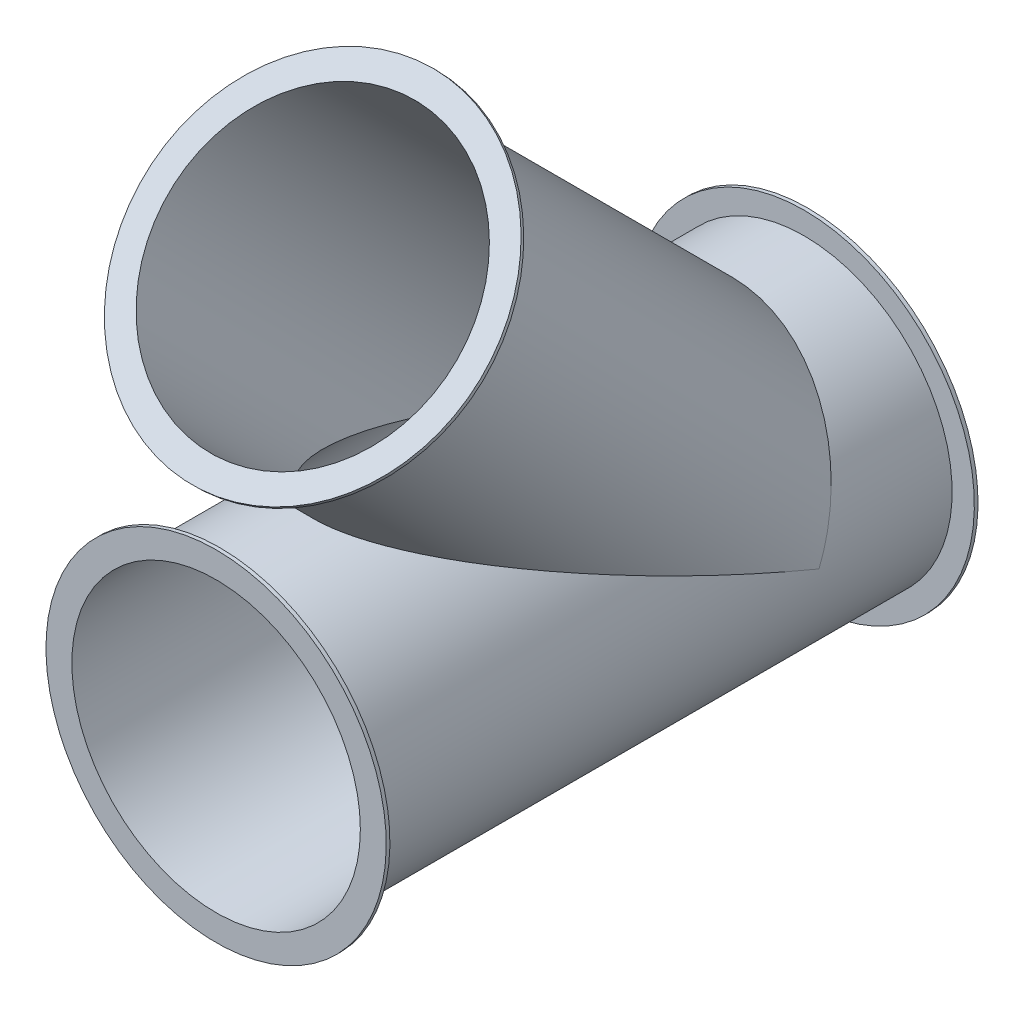
ISO-10303-21;
HEADER;
FILE_DESCRIPTION(('STEP AP214'),'2;1');
FILE_NAME('part.step','',(''),(''),'','','');
FILE_SCHEMA(('AUTOMOTIVE_DESIGN { 1 0 10303 214 1 1 1 1 }'));
ENDSEC;
DATA;
#1=APPLICATION_CONTEXT('core data for automotive mechanical design processes');
#2=APPLICATION_PROTOCOL_DEFINITION('international standard','automotive_design',2000,#1);
#3=PRODUCT_CONTEXT('',#1,'mechanical');
#4=PRODUCT('Part','Part','',(#3));
#5=PRODUCT_RELATED_PRODUCT_CATEGORY('part','',(#4));
#6=PRODUCT_DEFINITION_FORMATION('','',#4);
#7=PRODUCT_DEFINITION_CONTEXT('part definition',#1,'design');
#8=PRODUCT_DEFINITION('design','',#6,#7);
#9=PRODUCT_DEFINITION_SHAPE('','',#8);
#10=(LENGTH_UNIT() NAMED_UNIT(*) SI_UNIT(.MILLI.,.METRE.));
#11=(NAMED_UNIT(*) PLANE_ANGLE_UNIT() SI_UNIT($,.RADIAN.));
#12=(NAMED_UNIT(*) SI_UNIT($,.STERADIAN.) SOLID_ANGLE_UNIT());
#13=UNCERTAINTY_MEASURE_WITH_UNIT(LENGTH_MEASURE(1.E-05),#10,'distance_accuracy_value','');
#14=(GEOMETRIC_REPRESENTATION_CONTEXT(3) GLOBAL_UNCERTAINTY_ASSIGNED_CONTEXT((#13)) GLOBAL_UNIT_ASSIGNED_CONTEXT((#10,
#11,#12)) REPRESENTATION_CONTEXT('',''));
#15=CARTESIAN_POINT('',(0.,0.,0.));
#16=DIRECTION('',(0.,0.,1.));
#17=DIRECTION('',(1.,0.,0.));
#18=AXIS2_PLACEMENT_3D('',#15,#16,#17);
#19=CARTESIAN_POINT('',(0.,43.,142.551262838995));
#20=DIRECTION('',(0.,0.,-1.));
#21=DIRECTION('',(0.,-1.,0.));
#22=AXIS2_PLACEMENT_3D('',#19,#20,#21);
#23=PLANE('',#22);
#24=CARTESIAN_POINT('',(0.,0.,142.551262838995));
#25=DIRECTION('',(0.,0.,-1.));
#26=DIRECTION('',(0.,1.,0.));
#27=AXIS2_PLACEMENT_3D('',#24,#25,#26);
#28=CIRCLE('',#27,40.);
#29=CARTESIAN_POINT('',(0.,40.,142.551262838995));
#30=VERTEX_POINT('',#29);
#31=EDGE_CURVE('E123',#30,#30,#28,.T.);
#32=ORIENTED_EDGE('',*,*,#31,.F.);
#33=EDGE_LOOP('',(#32));
#34=FACE_BOUND('',#33,.T.);
#35=CARTESIAN_POINT('',(0.,0.,142.551262838995));
#36=DIRECTION('',(0.,0.,-1.));
#37=DIRECTION('',(0.,1.,0.));
#38=AXIS2_PLACEMENT_3D('',#35,#36,#37);
#39=CIRCLE('',#38,46.);
#40=CARTESIAN_POINT('',(0.,46.,142.551262838995));
#41=VERTEX_POINT('',#40);
#42=EDGE_CURVE('E10',#41,#41,#39,.T.);
#43=ORIENTED_EDGE('',*,*,#42,.T.);
#44=EDGE_LOOP('',(#43));
#45=FACE_BOUND('',#44,.T.);
#46=ADVANCED_FACE('F16',(#34,#45),#23,.T.);
#47=CARTESIAN_POINT('',(0.,0.,143.051262838995));
#48=DIRECTION('',(0.,0.,-1.));
#49=DIRECTION('',(0.,1.,0.));
#50=AXIS2_PLACEMENT_3D('',#47,#48,#49);
#51=CYLINDRICAL_SURFACE('',#50,46.);
#52=CARTESIAN_POINT('',(0.,0.,143.551262838995));
#53=DIRECTION('',(0.,0.,-1.));
#54=DIRECTION('',(0.,1.,0.));
#55=AXIS2_PLACEMENT_3D('',#52,#53,#54);
#56=CIRCLE('',#55,46.);
#57=CARTESIAN_POINT('',(0.,46.,143.551262838995));
#58=VERTEX_POINT('',#57);
#59=EDGE_CURVE('E27',#58,#58,#56,.T.);
#60=ORIENTED_EDGE('',*,*,#59,.T.);
#61=EDGE_LOOP('',(#60));
#62=FACE_BOUND('',#61,.T.);
#63=ORIENTED_EDGE('',*,*,#42,.F.);
#64=EDGE_LOOP('',(#63));
#65=FACE_BOUND('',#64,.T.);
#66=ADVANCED_FACE('F172',(#62,#65),#51,.T.);
#67=CARTESIAN_POINT('',(0.,23.,143.551262838995));
#68=DIRECTION('',(0.,0.,1.));
#69=DIRECTION('',(1.,0.,0.));
#70=AXIS2_PLACEMENT_3D('',#67,#68,#69);
#71=PLANE('',#70);
#72=CARTESIAN_POINT('',(0.,0.,143.551262838995));
#73=DIRECTION('',(0.,0.,-1.));
#74=DIRECTION('',(-1.,0.,0.));
#75=AXIS2_PLACEMENT_3D('',#72,#73,#74);
#76=CIRCLE('',#75,39.);
#77=CARTESIAN_POINT('',(39.,0.,143.551262838995));
#78=VERTEX_POINT('',#77);
#79=EDGE_CURVE('E110',#78,#78,#76,.T.);
#80=ORIENTED_EDGE('',*,*,#79,.T.);
#81=EDGE_LOOP('',(#80));
#82=FACE_BOUND('',#81,.T.);
#83=ORIENTED_EDGE('',*,*,#59,.F.);
#84=EDGE_LOOP('',(#83));
#85=FACE_BOUND('',#84,.T.);
#86=ADVANCED_FACE('F178',(#82,#85),#71,.T.);
#87=CARTESIAN_POINT('',(0.,48.0832611206852,68.6345239596802));
#88=DIRECTION('',(0.,-0.707106781186548,-0.707106781186548));
#89=DIRECTION('',(0.,0.707106781186548,-0.707106781186548));
#90=AXIS2_PLACEMENT_3D('',#87,#88,#89);
#91=CYLINDRICAL_SURFACE('',#90,40.);
#92=CARTESIAN_POINT('',(0.,96.1665222413705,116.717785080365));
#93=DIRECTION('',(0.,-0.707106781186548,-0.707106781186548));
#94=DIRECTION('',(0.,0.707106781186548,-0.707106781186548));
#95=AXIS2_PLACEMENT_3D('',#92,#93,#94);
#96=CIRCLE('',#95,40.);
#97=CARTESIAN_POINT('',(0.,124.450793488832,88.4335138329035));
#98=VERTEX_POINT('',#97);
#99=EDGE_CURVE('E125',#98,#98,#96,.T.);
#100=ORIENTED_EDGE('',*,*,#99,.T.);
#101=EDGE_LOOP('',(#100));
#102=FACE_BOUND('',#101,.T.);
#103=CARTESIAN_POINT('',(0.,0.,20.5512628389949));
#104=DIRECTION('',(0.,-0.382683432365089,-0.923879532511287));
#105=DIRECTION('',(0.,0.923879532511287,-0.382683432365089));
#106=AXIS2_PLACEMENT_3D('',#103,#104,#105);
#107=ELLIPSE('',#106,43.2956880116957,40.);
#108=CARTESIAN_POINT('',(-40.,0.,20.5512628389949));
#109=VERTEX_POINT('',#108);
#110=CARTESIAN_POINT('',(40.,0.,20.5512628389949));
#111=VERTEX_POINT('',#110);
#112=EDGE_CURVE('E111',#109,#111,#107,.T.);
#113=ORIENTED_EDGE('',*,*,#112,.F.);
#114=CARTESIAN_POINT('',(0.,0.,20.5512628389949));
#115=DIRECTION('',(0.,-0.923879532511287,0.38268343236509));
#116=DIRECTION('',(0.,-0.38268343236509,-0.923879532511287));
#117=AXIS2_PLACEMENT_3D('',#114,#115,#116);
#118=ELLIPSE('',#117,104.52503719011,40.);
#119=EDGE_CURVE('E115',#111,#109,#118,.T.);
#120=ORIENTED_EDGE('',*,*,#119,.F.);
#121=EDGE_LOOP('',(#113,#120));
#122=FACE_BOUND('',#121,.T.);
#123=ADVANCED_FACE('F182',(#102,#122),#91,.T.);
#124=CARTESIAN_POINT('',(0.,126.572113832392,86.3121934893439));
#125=DIRECTION('',(0.,-0.707106781186547,-0.707106781186548));
#126=DIRECTION('',(0.,-0.707106781186548,0.707106781186547));
#127=AXIS2_PLACEMENT_3D('',#124,#125,#126);
#128=PLANE('',#127);
#129=ORIENTED_EDGE('',*,*,#99,.F.);
#130=EDGE_LOOP('',(#129));
#131=FACE_BOUND('',#130,.T.);
#132=CARTESIAN_POINT('',(0.,96.1665222413704,116.717785080365));
#133=DIRECTION('',(0.,-0.707106781186548,-0.707106781186548));
#134=DIRECTION('',(0.,0.707106781186548,-0.707106781186548));
#135=AXIS2_PLACEMENT_3D('',#132,#133,#134);
#136=CIRCLE('',#135,46.);
#137=CARTESIAN_POINT('',(0.,128.693434175952,84.1908731457843));
#138=VERTEX_POINT('',#137);
#139=EDGE_CURVE('E128',#138,#138,#136,.T.);
#140=ORIENTED_EDGE('',*,*,#139,.T.);
#141=EDGE_LOOP('',(#140));
#142=FACE_BOUND('',#141,.T.);
#143=ADVANCED_FACE('F169',(#131,#142),#128,.T.);
#144=CARTESIAN_POINT('',(0.,96.5200756319637,117.071338470959));
#145=DIRECTION('',(0.,-0.707106781186548,-0.707106781186548));
#146=DIRECTION('',(0.,0.707106781186548,-0.707106781186548));
#147=AXIS2_PLACEMENT_3D('',#144,#145,#146);
#148=CYLINDRICAL_SURFACE('',#147,46.);
#149=CARTESIAN_POINT('',(0.,96.873629022557,117.424891861552));
#150=DIRECTION('',(0.,-0.707106781186548,-0.707106781186548));
#151=DIRECTION('',(0.,0.707106781186548,-0.707106781186548));
#152=AXIS2_PLACEMENT_3D('',#149,#150,#151);
#153=CIRCLE('',#152,46.);
#154=CARTESIAN_POINT('',(0.,129.400540957138,84.8979799269708));
#155=VERTEX_POINT('',#154);
#156=EDGE_CURVE('E114',#155,#155,#153,.T.);
#157=ORIENTED_EDGE('',*,*,#156,.T.);
#158=EDGE_LOOP('',(#157));
#159=FACE_BOUND('',#158,.T.);
#160=ORIENTED_EDGE('',*,*,#139,.F.);
#161=EDGE_LOOP('',(#160));
#162=FACE_BOUND('',#161,.T.);
#163=ADVANCED_FACE('F155',(#159,#162),#148,.T.);
#164=CARTESIAN_POINT('',(0.,113.137084989848,101.161435894261));
#165=DIRECTION('',(0.,0.707106781186547,0.707106781186548));
#166=DIRECTION('',(1.,0.,0.));
#167=AXIS2_PLACEMENT_3D('',#164,#165,#166);
#168=PLANE('',#167);
#169=CARTESIAN_POINT('',(0.,96.873629022557,117.424891861552));
#170=DIRECTION('',(0.,-0.707106781186547,-0.707106781186548));
#171=DIRECTION('',(-1.,0.,0.));
#172=AXIS2_PLACEMENT_3D('',#169,#170,#171);
#173=CIRCLE('',#172,39.);
#174=CARTESIAN_POINT('',(39.,96.873629022557,117.424891861552));
#175=VERTEX_POINT('',#174);
#176=EDGE_CURVE('E20',#175,#175,#173,.T.);
#177=ORIENTED_EDGE('',*,*,#176,.T.);
#178=EDGE_LOOP('',(#177));
#179=FACE_BOUND('',#178,.T.);
#180=ORIENTED_EDGE('',*,*,#156,.F.);
#181=EDGE_LOOP('',(#180));
#182=FACE_BOUND('',#181,.T.);
#183=ADVANCED_FACE('F18',(#179,#182),#168,.T.);
#184=CARTESIAN_POINT('',(0.,0.,63.5512628389949));
#185=DIRECTION('',(0.,0.,-1.));
#186=DIRECTION('',(0.,1.,0.));
#187=AXIS2_PLACEMENT_3D('',#184,#185,#186);
#188=CYLINDRICAL_SURFACE('',#187,40.);
#189=CARTESIAN_POINT('',(0.,0.,-15.4487371610051));
#190=DIRECTION('',(0.,0.,-1.));
#191=DIRECTION('',(0.,1.,0.));
#192=AXIS2_PLACEMENT_3D('',#189,#190,#191);
#193=CIRCLE('',#192,40.);
#194=CARTESIAN_POINT('',(0.,40.,-15.4487371610051));
#195=VERTEX_POINT('',#194);
#196=EDGE_CURVE('E119',#195,#195,#193,.T.);
#197=ORIENTED_EDGE('',*,*,#196,.F.);
#198=EDGE_LOOP('',(#197));
#199=FACE_BOUND('',#198,.T.);
#200=ORIENTED_EDGE('',*,*,#119,.T.);
#201=ORIENTED_EDGE('',*,*,#112,.T.);
#202=EDGE_LOOP('',(#200,#201));
#203=FACE_BOUND('',#202,.T.);
#204=ORIENTED_EDGE('',*,*,#31,.T.);
#205=EDGE_LOOP('',(#204));
#206=FACE_BOUND('',#205,.T.);
#207=ADVANCED_FACE('F159',(#199,#203,#206),#188,.T.);
#208=CARTESIAN_POINT('',(0.,43.,-15.4487371610051));
#209=DIRECTION('',(0.,0.,1.));
#210=DIRECTION('',(1.,0.,0.));
#211=AXIS2_PLACEMENT_3D('',#208,#209,#210);
#212=PLANE('',#211);
#213=ORIENTED_EDGE('',*,*,#196,.T.);
#214=EDGE_LOOP('',(#213));
#215=FACE_BOUND('',#214,.T.);
#216=CARTESIAN_POINT('',(0.,0.,-15.4487371610051));
#217=DIRECTION('',(0.,0.,-1.));
#218=DIRECTION('',(0.,1.,0.));
#219=AXIS2_PLACEMENT_3D('',#216,#217,#218);
#220=CIRCLE('',#219,46.);
#221=CARTESIAN_POINT('',(0.,46.,-15.4487371610051));
#222=VERTEX_POINT('',#221);
#223=EDGE_CURVE('E124',#222,#222,#220,.T.);
#224=ORIENTED_EDGE('',*,*,#223,.F.);
#225=EDGE_LOOP('',(#224));
#226=FACE_BOUND('',#225,.T.);
#227=ADVANCED_FACE('F166',(#215,#226),#212,.T.);
#228=CARTESIAN_POINT('',(0.,0.,-15.9487371610051));
#229=DIRECTION('',(0.,0.,-1.));
#230=DIRECTION('',(0.,1.,0.));
#231=AXIS2_PLACEMENT_3D('',#228,#229,#230);
#232=CYLINDRICAL_SURFACE('',#231,46.);
#233=ORIENTED_EDGE('',*,*,#223,.T.);
#234=EDGE_LOOP('',(#233));
#235=FACE_BOUND('',#234,.T.);
#236=CARTESIAN_POINT('',(0.,0.,-16.4487371610051));
#237=DIRECTION('',(0.,0.,-1.));
#238=DIRECTION('',(0.,1.,0.));
#239=AXIS2_PLACEMENT_3D('',#236,#237,#238);
#240=CIRCLE('',#239,46.);
#241=CARTESIAN_POINT('',(0.,46.,-16.4487371610051));
#242=VERTEX_POINT('',#241);
#243=EDGE_CURVE('E98',#242,#242,#240,.T.);
#244=ORIENTED_EDGE('',*,*,#243,.F.);
#245=EDGE_LOOP('',(#244));
#246=FACE_BOUND('',#245,.T.);
#247=ADVANCED_FACE('F190',(#235,#246),#232,.T.);
#248=CARTESIAN_POINT('',(0.,0.,143.551262838995));
#249=DIRECTION('',(0.,0.,-1.));
#250=DIRECTION('',(-1.,0.,0.));
#251=AXIS2_PLACEMENT_3D('',#248,#249,#250);
#252=CYLINDRICAL_SURFACE('',#251,39.);
#253=CARTESIAN_POINT('',(0.,0.,-16.4487371610051));
#254=DIRECTION('',(0.,0.,1.));
#255=DIRECTION('',(-1.,0.,0.));
#256=AXIS2_PLACEMENT_3D('',#253,#254,#255);
#257=CIRCLE('',#256,39.);
#258=CARTESIAN_POINT('',(39.,0.,-16.4487371610051));
#259=VERTEX_POINT('',#258);
#260=EDGE_CURVE('E118',#259,#259,#257,.T.);
#261=ORIENTED_EDGE('',*,*,#260,.F.);
#262=EDGE_LOOP('',(#261));
#263=FACE_BOUND('',#262,.T.);
#264=CARTESIAN_POINT('',(0.,0.,20.5512628389949));
#265=DIRECTION('',(0.,0.382683432365091,0.923879532511287));
#266=DIRECTION('',(0.,0.923879532511287,-0.382683432365091));
#267=AXIS2_PLACEMENT_3D('',#264,#265,#266);
#268=ELLIPSE('',#267,42.2132958114034,39.);
#269=CARTESIAN_POINT('',(39.,0.,20.5512628389949));
#270=VERTEX_POINT('',#269);
#271=CARTESIAN_POINT('',(-39.,0.,20.5512628389949));
#272=VERTEX_POINT('',#271);
#273=EDGE_CURVE('E96',#270,#272,#268,.T.);
#274=ORIENTED_EDGE('',*,*,#273,.T.);
#275=CARTESIAN_POINT('',(0.,0.,20.5512628389949));
#276=DIRECTION('',(0.,0.923879532511287,-0.382683432365089));
#277=DIRECTION('',(0.,-0.382683432365089,-0.923879532511287));
#278=AXIS2_PLACEMENT_3D('',#275,#276,#277);
#279=ELLIPSE('',#278,101.911911260357,39.);
#280=EDGE_CURVE('E88',#272,#270,#279,.T.);
#281=ORIENTED_EDGE('',*,*,#280,.T.);
#282=EDGE_LOOP('',(#274,#281));
#283=FACE_BOUND('',#282,.T.);
#284=ORIENTED_EDGE('',*,*,#79,.F.);
#285=EDGE_LOOP('',(#284));
#286=FACE_BOUND('',#285,.T.);
#287=ADVANCED_FACE('F94',(#263,#283,#286),#252,.F.);
#288=CARTESIAN_POINT('',(0.,23.,-16.4487371610051));
#289=DIRECTION('',(0.,0.,-1.));
#290=DIRECTION('',(0.,-1.,0.));
#291=AXIS2_PLACEMENT_3D('',#288,#289,#290);
#292=PLANE('',#291);
#293=ORIENTED_EDGE('',*,*,#260,.T.);
#294=EDGE_LOOP('',(#293));
#295=FACE_BOUND('',#294,.T.);
#296=ORIENTED_EDGE('',*,*,#243,.T.);
#297=EDGE_LOOP('',(#296));
#298=FACE_BOUND('',#297,.T.);
#299=ADVANCED_FACE('F185',(#295,#298),#292,.T.);
#300=CARTESIAN_POINT('',(0.,96.873629022557,117.424891861552));
#301=DIRECTION('',(0.,-0.707106781186547,-0.707106781186548));
#302=DIRECTION('',(-1.,0.,0.));
#303=AXIS2_PLACEMENT_3D('',#300,#301,#302);
#304=CYLINDRICAL_SURFACE('',#303,39.);
#305=ORIENTED_EDGE('',*,*,#273,.F.);
#306=ORIENTED_EDGE('',*,*,#280,.F.);
#307=EDGE_LOOP('',(#305,#306));
#308=FACE_BOUND('',#307,.T.);
#309=ORIENTED_EDGE('',*,*,#176,.F.);
#310=EDGE_LOOP('',(#309));
#311=FACE_BOUND('',#310,.T.);
#312=ADVANCED_FACE('F100',(#308,#311),#304,.F.);
#313=CLOSED_SHELL('',(#46,#66,#86,#123,#143,#163,#183,#207,#227,#247,#287,#299,#312));
#314=MANIFOLD_SOLID_BREP('B1',#313);
#315=ADVANCED_BREP_SHAPE_REPRESENTATION('',(#18,#314),#14);
#316=SHAPE_DEFINITION_REPRESENTATION(#9,#315);
ENDSEC;
END-ISO-10303-21;
